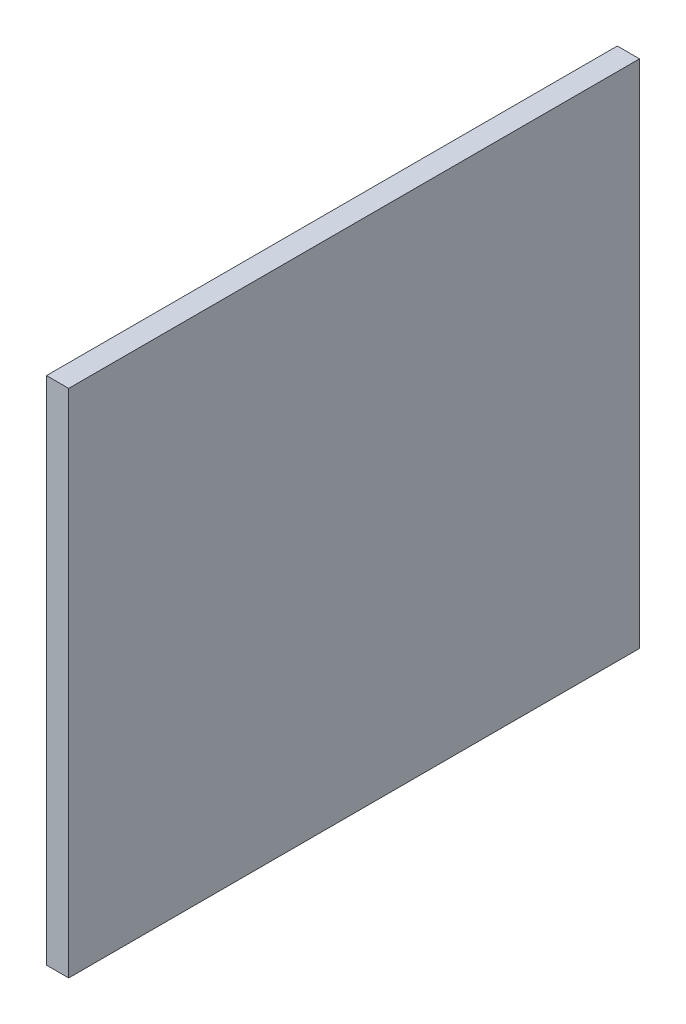
ISO-10303-21;
HEADER;
FILE_DESCRIPTION(('STEP AP214'),'2;1');
FILE_NAME('part.step','',(''),(''),'','','');
FILE_SCHEMA(('AUTOMOTIVE_DESIGN { 1 0 10303 214 1 1 1 1 }'));
ENDSEC;
DATA;
#1=APPLICATION_CONTEXT('core data for automotive mechanical design processes');
#2=APPLICATION_PROTOCOL_DEFINITION('international standard','automotive_design',2000,#1);
#3=PRODUCT_CONTEXT('',#1,'mechanical');
#4=PRODUCT('Part','Part','',(#3));
#5=PRODUCT_RELATED_PRODUCT_CATEGORY('part','',(#4));
#6=PRODUCT_DEFINITION_FORMATION('','',#4);
#7=PRODUCT_DEFINITION_CONTEXT('part definition',#1,'design');
#8=PRODUCT_DEFINITION('design','',#6,#7);
#9=PRODUCT_DEFINITION_SHAPE('','',#8);
#10=(LENGTH_UNIT() NAMED_UNIT(*) SI_UNIT(.MILLI.,.METRE.));
#11=(NAMED_UNIT(*) PLANE_ANGLE_UNIT() SI_UNIT($,.RADIAN.));
#12=(NAMED_UNIT(*) SI_UNIT($,.STERADIAN.) SOLID_ANGLE_UNIT());
#13=UNCERTAINTY_MEASURE_WITH_UNIT(LENGTH_MEASURE(1.E-05),#10,'distance_accuracy_value','');
#14=(GEOMETRIC_REPRESENTATION_CONTEXT(3) GLOBAL_UNCERTAINTY_ASSIGNED_CONTEXT((#13)) GLOBAL_UNIT_ASSIGNED_CONTEXT((#10,
#11,#12)) REPRESENTATION_CONTEXT('',''));
#15=CARTESIAN_POINT('',(0.,0.,0.));
#16=DIRECTION('',(0.,0.,1.));
#17=DIRECTION('',(1.,0.,0.));
#18=AXIS2_PLACEMENT_3D('',#15,#16,#17);
#19=CARTESIAN_POINT('',(280.,-45.,0.));
#20=DIRECTION('',(0.,0.,1.));
#21=DIRECTION('',(1.,0.,0.));
#22=AXIS2_PLACEMENT_3D('',#19,#20,#21);
#23=PLANE('',#22);
#24=DIRECTION('',(0.,1.,0.));
#25=VECTOR('',#24,1.);
#26=CARTESIAN_POINT('',(275.,-45.,0.));
#27=LINE('',#26,#25);
#28=CARTESIAN_POINT('',(275.,-45.,0.));
#29=VERTEX_POINT('',#28);
#30=CARTESIAN_POINT('',(275.,69.8959813156576,0.));
#31=VERTEX_POINT('',#30);
#32=EDGE_CURVE('E101',#29,#31,#27,.T.);
#33=ORIENTED_EDGE('',*,*,#32,.T.);
#34=DIRECTION('',(-1.,0.,0.));
#35=VECTOR('',#34,1.);
#36=CARTESIAN_POINT('',(280.,69.8959813156576,0.));
#37=LINE('',#36,#35);
#38=CARTESIAN_POINT('',(280.,69.8959813156576,0.));
#39=VERTEX_POINT('',#38);
#40=EDGE_CURVE('E11',#39,#31,#37,.T.);
#41=ORIENTED_EDGE('',*,*,#40,.F.);
#42=DIRECTION('',(0.,1.,0.));
#43=VECTOR('',#42,1.);
#44=CARTESIAN_POINT('',(280.,-45.,0.));
#45=LINE('',#44,#43);
#46=CARTESIAN_POINT('',(280.,-45.,0.));
#47=VERTEX_POINT('',#46);
#48=EDGE_CURVE('E89',#47,#39,#45,.T.);
#49=ORIENTED_EDGE('',*,*,#48,.F.);
#50=DIRECTION('',(-1.,0.,0.));
#51=VECTOR('',#50,1.);
#52=CARTESIAN_POINT('',(280.,-45.,0.));
#53=LINE('',#52,#51);
#54=EDGE_CURVE('E97',#47,#29,#53,.T.);
#55=ORIENTED_EDGE('',*,*,#54,.T.);
#56=EDGE_LOOP('',(#33,#41,#49,#55));
#57=FACE_BOUND('',#56,.T.);
#58=ADVANCED_FACE('F38',(#57),#23,.F.);
#59=CARTESIAN_POINT('',(280.,69.8959813156576,0.));
#60=DIRECTION('',(0.,-1.,0.));
#61=DIRECTION('',(0.,0.,-1.));
#62=AXIS2_PLACEMENT_3D('',#59,#60,#61);
#63=PLANE('',#62);
#64=DIRECTION('',(0.,0.,1.));
#65=VECTOR('',#64,1.);
#66=CARTESIAN_POINT('',(275.,69.8959813156576,0.));
#67=LINE('',#66,#65);
#68=CARTESIAN_POINT('',(275.,69.8959813156576,128.442125645559));
#69=VERTEX_POINT('',#68);
#70=EDGE_CURVE('E93',#31,#69,#67,.T.);
#71=ORIENTED_EDGE('',*,*,#70,.T.);
#72=DIRECTION('',(-1.,0.,0.));
#73=VECTOR('',#72,1.);
#74=CARTESIAN_POINT('',(280.,69.8959813156576,128.442125645559));
#75=LINE('',#74,#73);
#76=CARTESIAN_POINT('',(280.,69.8959813156576,128.442125645559));
#77=VERTEX_POINT('',#76);
#78=EDGE_CURVE('E46',#77,#69,#75,.T.);
#79=ORIENTED_EDGE('',*,*,#78,.F.);
#80=DIRECTION('',(0.,0.,1.));
#81=VECTOR('',#80,1.);
#82=CARTESIAN_POINT('',(280.,69.8959813156576,0.));
#83=LINE('',#82,#81);
#84=EDGE_CURVE('E84',#39,#77,#83,.T.);
#85=ORIENTED_EDGE('',*,*,#84,.F.);
#86=ORIENTED_EDGE('',*,*,#40,.T.);
#87=EDGE_LOOP('',(#71,#79,#85,#86));
#88=FACE_BOUND('',#87,.T.);
#89=ADVANCED_FACE('F92',(#88),#63,.F.);
#90=CARTESIAN_POINT('',(280.,-45.,128.442125645559));
#91=DIRECTION('',(0.,0.,-1.));
#92=DIRECTION('',(-1.,0.,0.));
#93=AXIS2_PLACEMENT_3D('',#90,#91,#92);
#94=PLANE('',#93);
#95=DIRECTION('',(0.,-1.,0.));
#96=VECTOR('',#95,1.);
#97=CARTESIAN_POINT('',(275.,-45.,128.442125645559));
#98=LINE('',#97,#96);
#99=CARTESIAN_POINT('',(275.,-45.,128.442125645559));
#100=VERTEX_POINT('',#99);
#101=EDGE_CURVE('E71',#69,#100,#98,.T.);
#102=ORIENTED_EDGE('',*,*,#101,.T.);
#103=DIRECTION('',(-1.,0.,0.));
#104=VECTOR('',#103,1.);
#105=CARTESIAN_POINT('',(280.,-45.,128.442125645559));
#106=LINE('',#105,#104);
#107=CARTESIAN_POINT('',(280.,-45.,128.442125645559));
#108=VERTEX_POINT('',#107);
#109=EDGE_CURVE('E94',#108,#100,#106,.T.);
#110=ORIENTED_EDGE('',*,*,#109,.F.);
#111=DIRECTION('',(0.,-1.,0.));
#112=VECTOR('',#111,1.);
#113=CARTESIAN_POINT('',(280.,-45.,128.442125645559));
#114=LINE('',#113,#112);
#115=EDGE_CURVE('E87',#77,#108,#114,.T.);
#116=ORIENTED_EDGE('',*,*,#115,.F.);
#117=ORIENTED_EDGE('',*,*,#78,.T.);
#118=EDGE_LOOP('',(#102,#110,#116,#117));
#119=FACE_BOUND('',#118,.T.);
#120=ADVANCED_FACE('F95',(#119),#94,.F.);
#121=CARTESIAN_POINT('',(280.,-45.,0.));
#122=DIRECTION('',(0.,1.,0.));
#123=DIRECTION('',(0.,0.,1.));
#124=AXIS2_PLACEMENT_3D('',#121,#122,#123);
#125=PLANE('',#124);
#126=DIRECTION('',(0.,0.,-1.));
#127=VECTOR('',#126,1.);
#128=CARTESIAN_POINT('',(275.,-45.,0.));
#129=LINE('',#128,#127);
#130=EDGE_CURVE('E77',#100,#29,#129,.T.);
#131=ORIENTED_EDGE('',*,*,#130,.T.);
#132=ORIENTED_EDGE('',*,*,#54,.F.);
#133=DIRECTION('',(0.,0.,-1.));
#134=VECTOR('',#133,1.);
#135=CARTESIAN_POINT('',(280.,-45.,0.));
#136=LINE('',#135,#134);
#137=EDGE_CURVE('E54',#108,#47,#136,.T.);
#138=ORIENTED_EDGE('',*,*,#137,.F.);
#139=ORIENTED_EDGE('',*,*,#109,.T.);
#140=EDGE_LOOP('',(#131,#132,#138,#139));
#141=FACE_BOUND('',#140,.T.);
#142=ADVANCED_FACE('F108',(#141),#125,.F.);
#143=CARTESIAN_POINT('',(280.,0.,0.));
#144=DIRECTION('',(1.,0.,0.));
#145=DIRECTION('',(0.,0.,-1.));
#146=AXIS2_PLACEMENT_3D('',#143,#144,#145);
#147=PLANE('',#146);
#148=ORIENTED_EDGE('',*,*,#48,.T.);
#149=ORIENTED_EDGE('',*,*,#84,.T.);
#150=ORIENTED_EDGE('',*,*,#115,.T.);
#151=ORIENTED_EDGE('',*,*,#137,.T.);
#152=EDGE_LOOP('',(#148,#149,#150,#151));
#153=FACE_BOUND('',#152,.T.);
#154=ADVANCED_FACE('F85',(#153),#147,.T.);
#155=CARTESIAN_POINT('',(275.,0.,0.));
#156=DIRECTION('',(1.,0.,0.));
#157=DIRECTION('',(0.,0.,-1.));
#158=AXIS2_PLACEMENT_3D('',#155,#156,#157);
#159=PLANE('',#158);
#160=ORIENTED_EDGE('',*,*,#32,.F.);
#161=ORIENTED_EDGE('',*,*,#130,.F.);
#162=ORIENTED_EDGE('',*,*,#101,.F.);
#163=ORIENTED_EDGE('',*,*,#70,.F.);
#164=EDGE_LOOP('',(#160,#161,#162,#163));
#165=FACE_BOUND('',#164,.T.);
#166=ADVANCED_FACE('F111',(#165),#159,.F.);
#167=CLOSED_SHELL('',(#58,#89,#120,#142,#154,#166));
#168=MANIFOLD_SOLID_BREP('B2',#167);
#169=ADVANCED_BREP_SHAPE_REPRESENTATION('',(#18,#168),#14);
#170=SHAPE_DEFINITION_REPRESENTATION(#9,#169);
ENDSEC;
END-ISO-10303-21;
